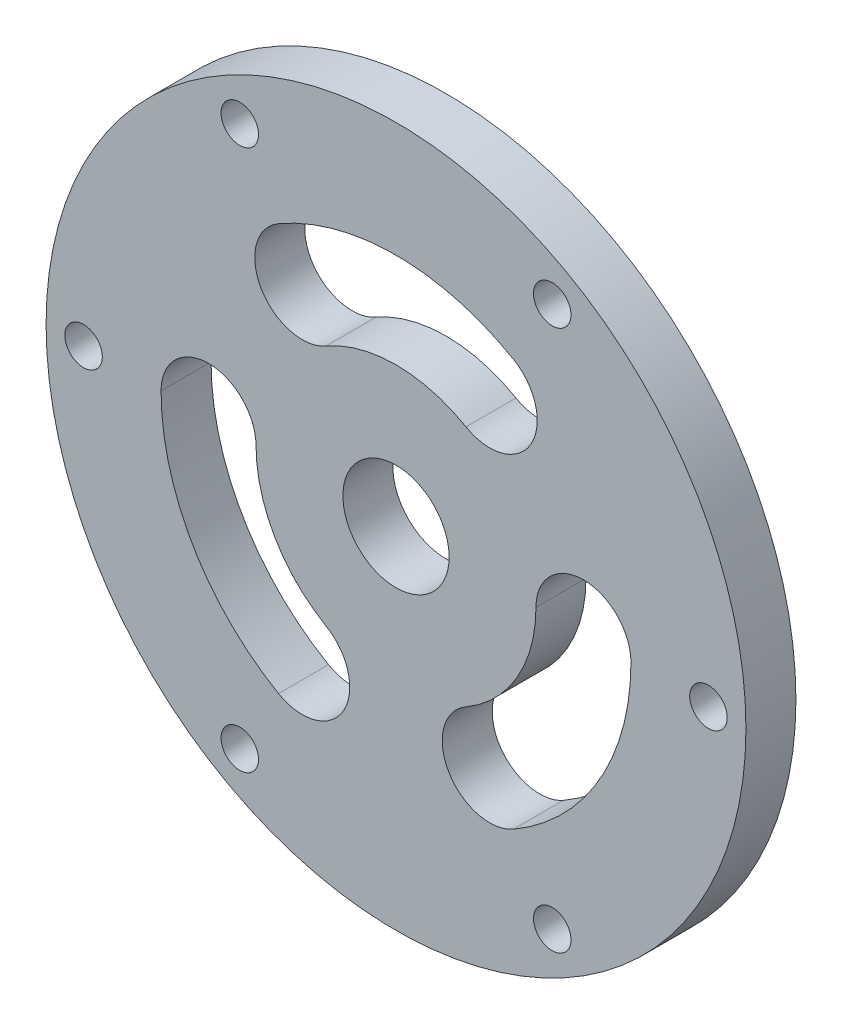
ISO-10303-21;
HEADER;
FILE_DESCRIPTION(('STEP AP214'),'2;1');
FILE_NAME('part.step','',(''),(''),'','','');
FILE_SCHEMA(('AUTOMOTIVE_DESIGN { 1 0 10303 214 1 1 1 1 }'));
ENDSEC;
DATA;
#1=APPLICATION_CONTEXT('core data for automotive mechanical design processes');
#2=APPLICATION_PROTOCOL_DEFINITION('international standard','automotive_design',2000,#1);
#3=PRODUCT_CONTEXT('',#1,'mechanical');
#4=PRODUCT('Part','Part','',(#3));
#5=PRODUCT_RELATED_PRODUCT_CATEGORY('part','',(#4));
#6=PRODUCT_DEFINITION_FORMATION('','',#4);
#7=PRODUCT_DEFINITION_CONTEXT('part definition',#1,'design');
#8=PRODUCT_DEFINITION('design','',#6,#7);
#9=PRODUCT_DEFINITION_SHAPE('','',#8);
#10=(LENGTH_UNIT() NAMED_UNIT(*) SI_UNIT(.MILLI.,.METRE.));
#11=(NAMED_UNIT(*) PLANE_ANGLE_UNIT() SI_UNIT($,.RADIAN.));
#12=(NAMED_UNIT(*) SI_UNIT($,.STERADIAN.) SOLID_ANGLE_UNIT());
#13=UNCERTAINTY_MEASURE_WITH_UNIT(LENGTH_MEASURE(1.E-05),#10,'distance_accuracy_value','');
#14=(GEOMETRIC_REPRESENTATION_CONTEXT(3) GLOBAL_UNCERTAINTY_ASSIGNED_CONTEXT((#13)) GLOBAL_UNIT_ASSIGNED_CONTEXT((#10,
#11,#12)) REPRESENTATION_CONTEXT('',''));
#15=CARTESIAN_POINT('',(0.,0.,0.));
#16=DIRECTION('',(0.,0.,1.));
#17=DIRECTION('',(1.,0.,0.));
#18=AXIS2_PLACEMENT_3D('',#15,#16,#17);
#19=CARTESIAN_POINT('',(0.,0.,4.));
#20=DIRECTION('',(0.,0.,1.));
#21=DIRECTION('',(1.,0.,0.));
#22=AXIS2_PLACEMENT_3D('',#19,#20,#21);
#23=PLANE('',#22);
#24=CARTESIAN_POINT('',(-24.9999999999986,-2.4721941194024E-12,4.));
#25=DIRECTION('',(0.,0.,1.));
#26=DIRECTION('',(1.,0.,0.));
#27=AXIS2_PLACEMENT_3D('',#24,#25,#26);
#28=CIRCLE('',#27,1.5000000000031);
#29=CARTESIAN_POINT('',(-23.4999999999955,-2.4721941194024E-12,4.));
#30=VERTEX_POINT('',#29);
#31=EDGE_CURVE('E269',#30,#30,#28,.T.);
#32=ORIENTED_EDGE('',*,*,#31,.F.);
#33=EDGE_LOOP('',(#32));
#34=FACE_BOUND('',#33,.T.);
#35=CARTESIAN_POINT('',(12.5000000000029,-21.650635094611,4.));
#36=DIRECTION('',(0.,0.,1.));
#37=DIRECTION('',(1.,0.,0.));
#38=AXIS2_PLACEMENT_3D('',#35,#36,#37);
#39=CIRCLE('',#38,1.5000000000031);
#40=CARTESIAN_POINT('',(14.000000000006,-21.650635094611,4.));
#41=VERTEX_POINT('',#40);
#42=EDGE_CURVE('E277',#41,#41,#39,.T.);
#43=ORIENTED_EDGE('',*,*,#42,.F.);
#44=EDGE_LOOP('',(#43));
#45=FACE_BOUND('',#44,.T.);
#46=CARTESIAN_POINT('',(0.,0.,4.));
#47=DIRECTION('',(0.,0.,-1.));
#48=DIRECTION('',(1.,0.,0.));
#49=AXIS2_PLACEMENT_3D('',#46,#47,#48);
#50=CIRCLE('',#49,11.2);
#51=CARTESIAN_POINT('',(-5.59999999999981,9.69948452238582,4.));
#52=VERTEX_POINT('',#51);
#53=CARTESIAN_POINT('',(5.60000000000007,9.69948452238566,4.));
#54=VERTEX_POINT('',#53);
#55=EDGE_CURVE('E129',#52,#54,#50,.T.);
#56=ORIENTED_EDGE('',*,*,#55,.F.);
#57=CARTESIAN_POINT('',(-7.49999999999975,12.9903810567667,4.));
#58=DIRECTION('',(0.,0.,1.));
#59=DIRECTION('',(-1.,0.,0.));
#60=AXIS2_PLACEMENT_3D('',#57,#58,#59);
#61=CIRCLE('',#60,3.8);
#62=CARTESIAN_POINT('',(-9.39999999999968,16.2812775911476,4.));
#63=VERTEX_POINT('',#62);
#64=EDGE_CURVE('E121',#63,#52,#61,.T.);
#65=ORIENTED_EDGE('',*,*,#64,.F.);
#66=CARTESIAN_POINT('',(0.,0.,4.));
#67=DIRECTION('',(0.,0.,1.));
#68=DIRECTION('',(1.,0.,0.));
#69=AXIS2_PLACEMENT_3D('',#66,#67,#68);
#70=CIRCLE('',#69,18.8);
#71=CARTESIAN_POINT('',(9.40000000000013,16.2812775911474,4.));
#72=VERTEX_POINT('',#71);
#73=EDGE_CURVE('E144',#72,#63,#70,.T.);
#74=ORIENTED_EDGE('',*,*,#73,.F.);
#75=CARTESIAN_POINT('',(7.5000000000001,12.9903810567665,4.));
#76=DIRECTION('',(0.,0.,1.));
#77=DIRECTION('',(1.,0.,0.));
#78=AXIS2_PLACEMENT_3D('',#75,#76,#77);
#79=CIRCLE('',#78,3.8);
#80=EDGE_CURVE('E142',#54,#72,#79,.T.);
#81=ORIENTED_EDGE('',*,*,#80,.F.);
#82=EDGE_LOOP('',(#56,#65,#74,#81));
#83=FACE_BOUND('',#82,.T.);
#84=CARTESIAN_POINT('',(12.5,21.650635094611,4.));
#85=DIRECTION('',(0.,0.,1.));
#86=DIRECTION('',(1.,0.,0.));
#87=AXIS2_PLACEMENT_3D('',#84,#85,#86);
#88=CIRCLE('',#87,1.5000000000031);
#89=CARTESIAN_POINT('',(14.0000000000031,21.650635094611,4.));
#90=VERTEX_POINT('',#89);
#91=EDGE_CURVE('E160',#90,#90,#88,.T.);
#92=ORIENTED_EDGE('',*,*,#91,.F.);
#93=EDGE_LOOP('',(#92));
#94=FACE_BOUND('',#93,.T.);
#95=CARTESIAN_POINT('',(0.,0.,4.));
#96=DIRECTION('',(0.,0.,-1.));
#97=DIRECTION('',(1.,0.,0.));
#98=AXIS2_PLACEMENT_3D('',#95,#96,#97);
#99=CIRCLE('',#98,11.2);
#100=CARTESIAN_POINT('',(-5.60000000000015,-9.69948452238563,4.));
#101=VERTEX_POINT('',#100);
#102=CARTESIAN_POINT('',(-11.2,0.,4.));
#103=VERTEX_POINT('',#102);
#104=EDGE_CURVE('E174',#101,#103,#99,.T.);
#105=ORIENTED_EDGE('',*,*,#104,.F.);
#106=CARTESIAN_POINT('',(-7.5000000000002,-12.9903810567665,4.));
#107=DIRECTION('',(0.,0.,1.));
#108=DIRECTION('',(-1.,0.,0.));
#109=AXIS2_PLACEMENT_3D('',#106,#107,#108);
#110=CIRCLE('',#109,3.8);
#111=CARTESIAN_POINT('',(-9.40000000000025,-16.2812775911473,4.));
#112=VERTEX_POINT('',#111);
#113=EDGE_CURVE('E172',#112,#101,#110,.T.);
#114=ORIENTED_EDGE('',*,*,#113,.F.);
#115=CARTESIAN_POINT('',(0.,0.,4.));
#116=DIRECTION('',(0.,0.,1.));
#117=DIRECTION('',(1.,0.,0.));
#118=AXIS2_PLACEMENT_3D('',#115,#116,#117);
#119=CIRCLE('',#118,18.8);
#120=CARTESIAN_POINT('',(-18.8,0.,4.));
#121=VERTEX_POINT('',#120);
#122=EDGE_CURVE('E180',#121,#112,#119,.T.);
#123=ORIENTED_EDGE('',*,*,#122,.F.);
#124=CARTESIAN_POINT('',(-15.,0.,4.));
#125=DIRECTION('',(0.,0.,1.));
#126=DIRECTION('',(1.,0.,0.));
#127=AXIS2_PLACEMENT_3D('',#124,#125,#126);
#128=CIRCLE('',#127,3.8);
#129=EDGE_CURVE('E177',#103,#121,#128,.T.);
#130=ORIENTED_EDGE('',*,*,#129,.F.);
#131=EDGE_LOOP('',(#105,#114,#123,#130));
#132=FACE_BOUND('',#131,.T.);
#133=CARTESIAN_POINT('',(15.,-1.57859836313889E-13,4.));
#134=DIRECTION('',(0.,0.,1.));
#135=DIRECTION('',(-1.,0.,0.));
#136=AXIS2_PLACEMENT_3D('',#133,#134,#135);
#137=CIRCLE('',#136,3.8);
#138=CARTESIAN_POINT('',(18.8,-1.96207867471109E-13,4.));
#139=VERTEX_POINT('',#138);
#140=CARTESIAN_POINT('',(11.2,-1.17961196366423E-13,4.));
#141=VERTEX_POINT('',#140);
#142=EDGE_CURVE('E205',#139,#141,#137,.T.);
#143=ORIENTED_EDGE('',*,*,#142,.F.);
#144=CARTESIAN_POINT('',(0.,0.,4.));
#145=DIRECTION('',(0.,0.,1.));
#146=DIRECTION('',(1.,0.,0.));
#147=AXIS2_PLACEMENT_3D('',#144,#145,#146);
#148=CIRCLE('',#147,18.8);
#149=CARTESIAN_POINT('',(9.40000000000002,-16.2812775911474,4.));
#150=VERTEX_POINT('',#149);
#151=EDGE_CURVE('E203',#150,#139,#148,.T.);
#152=ORIENTED_EDGE('',*,*,#151,.F.);
#153=CARTESIAN_POINT('',(7.50000000000002,-12.9903810567666,4.));
#154=DIRECTION('',(0.,0.,1.));
#155=DIRECTION('',(1.,0.,0.));
#156=AXIS2_PLACEMENT_3D('',#153,#154,#155);
#157=CIRCLE('',#156,3.8);
#158=CARTESIAN_POINT('',(5.60000000000001,-9.69948452238571,4.));
#159=VERTEX_POINT('',#158);
#160=EDGE_CURVE('E211',#159,#150,#157,.T.);
#161=ORIENTED_EDGE('',*,*,#160,.F.);
#162=CARTESIAN_POINT('',(0.,0.,4.));
#163=DIRECTION('',(0.,0.,-1.));
#164=DIRECTION('',(1.,0.,0.));
#165=AXIS2_PLACEMENT_3D('',#162,#163,#164);
#166=CIRCLE('',#165,11.2);
#167=EDGE_CURVE('E208',#141,#159,#166,.T.);
#168=ORIENTED_EDGE('',*,*,#167,.F.);
#169=EDGE_LOOP('',(#143,#152,#161,#168));
#170=FACE_BOUND('',#169,.T.);
#171=CARTESIAN_POINT('',(0.,0.,4.));
#172=DIRECTION('',(0.,0.,1.));
#173=DIRECTION('',(1.,0.,0.));
#174=AXIS2_PLACEMENT_3D('',#171,#172,#173);
#175=CIRCLE('',#174,28.);
#176=CARTESIAN_POINT('',(28.,0.,4.));
#177=VERTEX_POINT('',#176);
#178=EDGE_CURVE('E11',#177,#177,#175,.T.);
#179=ORIENTED_EDGE('',*,*,#178,.T.);
#180=EDGE_LOOP('',(#179));
#181=FACE_BOUND('',#180,.T.);
#182=CARTESIAN_POINT('',(0.,0.,4.));
#183=DIRECTION('',(0.,0.,1.));
#184=DIRECTION('',(1.,0.,0.));
#185=AXIS2_PLACEMENT_3D('',#182,#183,#184);
#186=CIRCLE('',#185,4.25);
#187=CARTESIAN_POINT('',(4.25,0.,4.));
#188=VERTEX_POINT('',#187);
#189=EDGE_CURVE('E166',#188,#188,#186,.T.);
#190=ORIENTED_EDGE('',*,*,#189,.F.);
#191=EDGE_LOOP('',(#190));
#192=FACE_BOUND('',#191,.T.);
#193=CARTESIAN_POINT('',(25.0000000000014,8.27893104610886E-13,4.));
#194=DIRECTION('',(0.,0.,1.));
#195=DIRECTION('',(1.,0.,0.));
#196=AXIS2_PLACEMENT_3D('',#193,#194,#195);
#197=CIRCLE('',#196,1.5000000000031);
#198=CARTESIAN_POINT('',(26.5000000000045,8.27893104610886E-13,4.));
#199=VERTEX_POINT('',#198);
#200=EDGE_CURVE('E150',#199,#199,#197,.T.);
#201=ORIENTED_EDGE('',*,*,#200,.F.);
#202=EDGE_LOOP('',(#201));
#203=FACE_BOUND('',#202,.T.);
#204=CARTESIAN_POINT('',(-12.4999999999971,-21.6506350946126,4.));
#205=DIRECTION('',(0.,0.,1.));
#206=DIRECTION('',(1.,0.,0.));
#207=AXIS2_PLACEMENT_3D('',#204,#205,#206);
#208=CIRCLE('',#207,1.5000000000031);
#209=CARTESIAN_POINT('',(-10.999999999994,-21.6506350946126,4.));
#210=VERTEX_POINT('',#209);
#211=EDGE_CURVE('E273',#210,#210,#208,.T.);
#212=ORIENTED_EDGE('',*,*,#211,.F.);
#213=EDGE_LOOP('',(#212));
#214=FACE_BOUND('',#213,.T.);
#215=CARTESIAN_POINT('',(-12.5,21.6506350946093,4.));
#216=DIRECTION('',(0.,0.,1.));
#217=DIRECTION('',(1.,0.,0.));
#218=AXIS2_PLACEMENT_3D('',#215,#216,#217);
#219=CIRCLE('',#218,1.5000000000031);
#220=CARTESIAN_POINT('',(-10.9999999999969,21.6506350946093,4.));
#221=VERTEX_POINT('',#220);
#222=EDGE_CURVE('E264',#221,#221,#219,.T.);
#223=ORIENTED_EDGE('',*,*,#222,.F.);
#224=EDGE_LOOP('',(#223));
#225=FACE_BOUND('',#224,.T.);
#226=ADVANCED_FACE('F32',(#34,#45,#83,#94,#132,#170,#181,#192,#203,#214,#225),#23,.T.);
#227=CARTESIAN_POINT('',(0.,0.,0.));
#228=DIRECTION('',(0.,0.,1.));
#229=DIRECTION('',(1.,0.,0.));
#230=AXIS2_PLACEMENT_3D('',#227,#228,#229);
#231=PLANE('',#230);
#232=CARTESIAN_POINT('',(12.5,21.650635094611,0.));
#233=DIRECTION('',(0.,0.,1.));
#234=DIRECTION('',(1.,0.,0.));
#235=AXIS2_PLACEMENT_3D('',#232,#233,#234);
#236=CIRCLE('',#235,1.5000000000031);
#237=CARTESIAN_POINT('',(14.0000000000031,21.650635094611,0.));
#238=VERTEX_POINT('',#237);
#239=EDGE_CURVE('E137',#238,#238,#236,.T.);
#240=ORIENTED_EDGE('',*,*,#239,.T.);
#241=EDGE_LOOP('',(#240));
#242=FACE_BOUND('',#241,.T.);
#243=CARTESIAN_POINT('',(0.,0.,0.));
#244=DIRECTION('',(0.,0.,1.));
#245=DIRECTION('',(1.,0.,0.));
#246=AXIS2_PLACEMENT_3D('',#243,#244,#245);
#247=CIRCLE('',#246,4.25);
#248=CARTESIAN_POINT('',(4.25,0.,0.));
#249=VERTEX_POINT('',#248);
#250=EDGE_CURVE('E163',#249,#249,#247,.T.);
#251=ORIENTED_EDGE('',*,*,#250,.T.);
#252=EDGE_LOOP('',(#251));
#253=FACE_BOUND('',#252,.T.);
#254=CARTESIAN_POINT('',(-7.5000000000002,-12.9903810567665,0.));
#255=DIRECTION('',(0.,0.,1.));
#256=DIRECTION('',(-1.,0.,0.));
#257=AXIS2_PLACEMENT_3D('',#254,#255,#256);
#258=CIRCLE('',#257,3.8);
#259=CARTESIAN_POINT('',(-9.40000000000025,-16.2812775911473,0.));
#260=VERTEX_POINT('',#259);
#261=CARTESIAN_POINT('',(-5.60000000000015,-9.69948452238563,0.));
#262=VERTEX_POINT('',#261);
#263=EDGE_CURVE('E169',#260,#262,#258,.T.);
#264=ORIENTED_EDGE('',*,*,#263,.T.);
#265=CARTESIAN_POINT('',(0.,0.,0.));
#266=DIRECTION('',(0.,0.,-1.));
#267=DIRECTION('',(1.,0.,0.));
#268=AXIS2_PLACEMENT_3D('',#265,#266,#267);
#269=CIRCLE('',#268,11.2);
#270=CARTESIAN_POINT('',(-11.2,0.,0.));
#271=VERTEX_POINT('',#270);
#272=EDGE_CURVE('E185',#262,#271,#269,.T.);
#273=ORIENTED_EDGE('',*,*,#272,.T.);
#274=CARTESIAN_POINT('',(-15.,0.,0.));
#275=DIRECTION('',(0.,0.,1.));
#276=DIRECTION('',(1.,0.,0.));
#277=AXIS2_PLACEMENT_3D('',#274,#275,#276);
#278=CIRCLE('',#277,3.8);
#279=CARTESIAN_POINT('',(-18.8,0.,0.));
#280=VERTEX_POINT('',#279);
#281=EDGE_CURVE('E188',#271,#280,#278,.T.);
#282=ORIENTED_EDGE('',*,*,#281,.T.);
#283=CARTESIAN_POINT('',(0.,0.,0.));
#284=DIRECTION('',(0.,0.,1.));
#285=DIRECTION('',(1.,0.,0.));
#286=AXIS2_PLACEMENT_3D('',#283,#284,#285);
#287=CIRCLE('',#286,18.8);
#288=EDGE_CURVE('E175',#280,#260,#287,.T.);
#289=ORIENTED_EDGE('',*,*,#288,.T.);
#290=EDGE_LOOP('',(#264,#273,#282,#289));
#291=FACE_BOUND('',#290,.T.);
#292=CARTESIAN_POINT('',(0.,0.,0.));
#293=DIRECTION('',(0.,0.,1.));
#294=DIRECTION('',(1.,0.,0.));
#295=AXIS2_PLACEMENT_3D('',#292,#293,#294);
#296=CIRCLE('',#295,28.);
#297=CARTESIAN_POINT('',(28.,0.,0.));
#298=VERTEX_POINT('',#297);
#299=EDGE_CURVE('E36',#298,#298,#296,.T.);
#300=ORIENTED_EDGE('',*,*,#299,.F.);
#301=EDGE_LOOP('',(#300));
#302=FACE_BOUND('',#301,.T.);
#303=CARTESIAN_POINT('',(0.,0.,0.));
#304=DIRECTION('',(0.,0.,1.));
#305=DIRECTION('',(1.,0.,0.));
#306=AXIS2_PLACEMENT_3D('',#303,#304,#305);
#307=CIRCLE('',#306,18.8);
#308=CARTESIAN_POINT('',(9.40000000000002,-16.2812775911474,0.));
#309=VERTEX_POINT('',#308);
#310=CARTESIAN_POINT('',(18.8,-1.96207867471109E-13,0.));
#311=VERTEX_POINT('',#310);
#312=EDGE_CURVE('E202',#309,#311,#307,.T.);
#313=ORIENTED_EDGE('',*,*,#312,.T.);
#314=CARTESIAN_POINT('',(15.,-1.57859836313889E-13,0.));
#315=DIRECTION('',(0.,0.,1.));
#316=DIRECTION('',(-1.,0.,0.));
#317=AXIS2_PLACEMENT_3D('',#314,#315,#316);
#318=CIRCLE('',#317,3.8);
#319=CARTESIAN_POINT('',(11.2,-1.17961196366423E-13,0.));
#320=VERTEX_POINT('',#319);
#321=EDGE_CURVE('E216',#311,#320,#318,.T.);
#322=ORIENTED_EDGE('',*,*,#321,.T.);
#323=CARTESIAN_POINT('',(0.,0.,0.));
#324=DIRECTION('',(0.,0.,-1.));
#325=DIRECTION('',(1.,0.,0.));
#326=AXIS2_PLACEMENT_3D('',#323,#324,#325);
#327=CIRCLE('',#326,11.2);
#328=CARTESIAN_POINT('',(5.60000000000001,-9.69948452238571,0.));
#329=VERTEX_POINT('',#328);
#330=EDGE_CURVE('E219',#320,#329,#327,.T.);
#331=ORIENTED_EDGE('',*,*,#330,.T.);
#332=CARTESIAN_POINT('',(7.50000000000002,-12.9903810567666,0.));
#333=DIRECTION('',(0.,0.,1.));
#334=DIRECTION('',(1.,0.,0.));
#335=AXIS2_PLACEMENT_3D('',#332,#333,#334);
#336=CIRCLE('',#335,3.8);
#337=EDGE_CURVE('E206',#329,#309,#336,.T.);
#338=ORIENTED_EDGE('',*,*,#337,.T.);
#339=EDGE_LOOP('',(#313,#322,#331,#338));
#340=FACE_BOUND('',#339,.T.);
#341=CARTESIAN_POINT('',(-7.49999999999975,12.9903810567667,0.));
#342=DIRECTION('',(0.,0.,1.));
#343=DIRECTION('',(-1.,0.,0.));
#344=AXIS2_PLACEMENT_3D('',#341,#342,#343);
#345=CIRCLE('',#344,3.8);
#346=CARTESIAN_POINT('',(-9.39999999999968,16.2812775911476,0.));
#347=VERTEX_POINT('',#346);
#348=CARTESIAN_POINT('',(-5.59999999999981,9.69948452238582,0.));
#349=VERTEX_POINT('',#348);
#350=EDGE_CURVE('E55',#347,#349,#345,.T.);
#351=ORIENTED_EDGE('',*,*,#350,.T.);
#352=CARTESIAN_POINT('',(0.,0.,0.));
#353=DIRECTION('',(0.,0.,-1.));
#354=DIRECTION('',(1.,0.,0.));
#355=AXIS2_PLACEMENT_3D('',#352,#353,#354);
#356=CIRCLE('',#355,11.2);
#357=CARTESIAN_POINT('',(5.60000000000007,9.69948452238566,0.));
#358=VERTEX_POINT('',#357);
#359=EDGE_CURVE('E136',#349,#358,#356,.T.);
#360=ORIENTED_EDGE('',*,*,#359,.T.);
#361=CARTESIAN_POINT('',(7.5000000000001,12.9903810567665,0.));
#362=DIRECTION('',(0.,0.,1.));
#363=DIRECTION('',(1.,0.,0.));
#364=AXIS2_PLACEMENT_3D('',#361,#362,#363);
#365=CIRCLE('',#364,3.8);
#366=CARTESIAN_POINT('',(9.40000000000013,16.2812775911474,0.));
#367=VERTEX_POINT('',#366);
#368=EDGE_CURVE('E152',#358,#367,#365,.T.);
#369=ORIENTED_EDGE('',*,*,#368,.T.);
#370=CARTESIAN_POINT('',(0.,0.,0.));
#371=DIRECTION('',(0.,0.,1.));
#372=DIRECTION('',(1.,0.,0.));
#373=AXIS2_PLACEMENT_3D('',#370,#371,#372);
#374=CIRCLE('',#373,18.8);
#375=EDGE_CURVE('E130',#367,#347,#374,.T.);
#376=ORIENTED_EDGE('',*,*,#375,.T.);
#377=EDGE_LOOP('',(#351,#360,#369,#376));
#378=FACE_BOUND('',#377,.T.);
#379=CARTESIAN_POINT('',(25.0000000000014,8.27893104610886E-13,0.));
#380=DIRECTION('',(0.,0.,1.));
#381=DIRECTION('',(1.,0.,0.));
#382=AXIS2_PLACEMENT_3D('',#379,#380,#381);
#383=CIRCLE('',#382,1.5000000000031);
#384=CARTESIAN_POINT('',(26.5000000000045,8.27893104610886E-13,0.));
#385=VERTEX_POINT('',#384);
#386=EDGE_CURVE('E247',#385,#385,#383,.T.);
#387=ORIENTED_EDGE('',*,*,#386,.T.);
#388=EDGE_LOOP('',(#387));
#389=FACE_BOUND('',#388,.T.);
#390=CARTESIAN_POINT('',(12.5000000000029,-21.650635094611,0.));
#391=DIRECTION('',(0.,0.,1.));
#392=DIRECTION('',(1.,0.,0.));
#393=AXIS2_PLACEMENT_3D('',#390,#391,#392);
#394=CIRCLE('',#393,1.5000000000031);
#395=CARTESIAN_POINT('',(14.000000000006,-21.650635094611,0.));
#396=VERTEX_POINT('',#395);
#397=EDGE_CURVE('E251',#396,#396,#394,.T.);
#398=ORIENTED_EDGE('',*,*,#397,.T.);
#399=EDGE_LOOP('',(#398));
#400=FACE_BOUND('',#399,.T.);
#401=CARTESIAN_POINT('',(-12.4999999999971,-21.6506350946126,0.));
#402=DIRECTION('',(0.,0.,1.));
#403=DIRECTION('',(1.,0.,0.));
#404=AXIS2_PLACEMENT_3D('',#401,#402,#403);
#405=CIRCLE('',#404,1.5000000000031);
#406=CARTESIAN_POINT('',(-10.999999999994,-21.6506350946126,0.));
#407=VERTEX_POINT('',#406);
#408=EDGE_CURVE('E255',#407,#407,#405,.T.);
#409=ORIENTED_EDGE('',*,*,#408,.T.);
#410=EDGE_LOOP('',(#409));
#411=FACE_BOUND('',#410,.T.);
#412=CARTESIAN_POINT('',(-24.9999999999986,-2.4721941194024E-12,0.));
#413=DIRECTION('',(0.,0.,1.));
#414=DIRECTION('',(1.,0.,0.));
#415=AXIS2_PLACEMENT_3D('',#412,#413,#414);
#416=CIRCLE('',#415,1.5000000000031);
#417=CARTESIAN_POINT('',(-23.4999999999955,-2.4721941194024E-12,0.));
#418=VERTEX_POINT('',#417);
#419=EDGE_CURVE('E259',#418,#418,#416,.T.);
#420=ORIENTED_EDGE('',*,*,#419,.T.);
#421=EDGE_LOOP('',(#420));
#422=FACE_BOUND('',#421,.T.);
#423=CARTESIAN_POINT('',(-12.5,21.6506350946093,0.));
#424=DIRECTION('',(0.,0.,1.));
#425=DIRECTION('',(1.,0.,0.));
#426=AXIS2_PLACEMENT_3D('',#423,#424,#425);
#427=CIRCLE('',#426,1.5000000000031);
#428=CARTESIAN_POINT('',(-10.9999999999969,21.6506350946093,0.));
#429=VERTEX_POINT('',#428);
#430=EDGE_CURVE('E262',#429,#429,#427,.T.);
#431=ORIENTED_EDGE('',*,*,#430,.T.);
#432=EDGE_LOOP('',(#431));
#433=FACE_BOUND('',#432,.T.);
#434=ADVANCED_FACE('F238',(#242,#253,#291,#302,#340,#378,#389,#400,#411,#422,#433),#231,.F.);
#435=CARTESIAN_POINT('',(0.,0.,4.));
#436=DIRECTION('',(0.,0.,-1.));
#437=DIRECTION('',(-1.,0.,0.));
#438=AXIS2_PLACEMENT_3D('',#435,#436,#437);
#439=CYLINDRICAL_SURFACE('',#438,28.);
#440=ORIENTED_EDGE('',*,*,#178,.F.);
#441=EDGE_LOOP('',(#440));
#442=FACE_BOUND('',#441,.T.);
#443=ORIENTED_EDGE('',*,*,#299,.T.);
#444=EDGE_LOOP('',(#443));
#445=FACE_BOUND('',#444,.T.);
#446=ADVANCED_FACE('F34',(#442,#445),#439,.T.);
#447=CARTESIAN_POINT('',(0.,0.,4.));
#448=DIRECTION('',(0.,0.,-1.));
#449=DIRECTION('',(-1.,0.,0.));
#450=AXIS2_PLACEMENT_3D('',#447,#448,#449);
#451=CYLINDRICAL_SURFACE('',#450,18.8);
#452=ORIENTED_EDGE('',*,*,#312,.F.);
#453=DIRECTION('',(0.,0.,-1.));
#454=VECTOR('',#453,1.);
#455=CARTESIAN_POINT('',(9.40000000000002,-16.2812775911474,4.));
#456=LINE('',#455,#454);
#457=EDGE_CURVE('E213',#150,#309,#456,.T.);
#458=ORIENTED_EDGE('',*,*,#457,.F.);
#459=ORIENTED_EDGE('',*,*,#151,.T.);
#460=DIRECTION('',(0.,0.,-1.));
#461=VECTOR('',#460,1.);
#462=CARTESIAN_POINT('',(18.8,-1.96207867471109E-13,4.));
#463=LINE('',#462,#461);
#464=EDGE_CURVE('E230',#139,#311,#463,.T.);
#465=ORIENTED_EDGE('',*,*,#464,.T.);
#466=EDGE_LOOP('',(#452,#458,#459,#465));
#467=FACE_BOUND('',#466,.T.);
#468=ADVANCED_FACE('F361',(#467),#451,.F.);
#469=CARTESIAN_POINT('',(15.,-1.57859836313889E-13,4.));
#470=DIRECTION('',(0.,0.,-1.));
#471=DIRECTION('',(-1.,0.,0.));
#472=AXIS2_PLACEMENT_3D('',#469,#470,#471);
#473=CYLINDRICAL_SURFACE('',#472,3.8);
#474=ORIENTED_EDGE('',*,*,#321,.F.);
#475=ORIENTED_EDGE('',*,*,#464,.F.);
#476=ORIENTED_EDGE('',*,*,#142,.T.);
#477=DIRECTION('',(0.,0.,-1.));
#478=VECTOR('',#477,1.);
#479=CARTESIAN_POINT('',(11.2,-1.17961196366423E-13,4.));
#480=LINE('',#479,#478);
#481=EDGE_CURVE('E228',#141,#320,#480,.T.);
#482=ORIENTED_EDGE('',*,*,#481,.T.);
#483=EDGE_LOOP('',(#474,#475,#476,#482));
#484=FACE_BOUND('',#483,.T.);
#485=ADVANCED_FACE('F357',(#484),#473,.F.);
#486=CARTESIAN_POINT('',(0.,0.,4.));
#487=DIRECTION('',(0.,0.,-1.));
#488=DIRECTION('',(-1.,0.,0.));
#489=AXIS2_PLACEMENT_3D('',#486,#487,#488);
#490=CYLINDRICAL_SURFACE('',#489,11.2);
#491=ORIENTED_EDGE('',*,*,#330,.F.);
#492=ORIENTED_EDGE('',*,*,#481,.F.);
#493=ORIENTED_EDGE('',*,*,#167,.T.);
#494=DIRECTION('',(0.,0.,-1.));
#495=VECTOR('',#494,1.);
#496=CARTESIAN_POINT('',(5.60000000000001,-9.69948452238571,4.));
#497=LINE('',#496,#495);
#498=EDGE_CURVE('E226',#159,#329,#497,.T.);
#499=ORIENTED_EDGE('',*,*,#498,.T.);
#500=EDGE_LOOP('',(#491,#492,#493,#499));
#501=FACE_BOUND('',#500,.T.);
#502=ADVANCED_FACE('F353',(#501),#490,.T.);
#503=CARTESIAN_POINT('',(7.50000000000002,-12.9903810567666,4.));
#504=DIRECTION('',(0.,0.,-1.));
#505=DIRECTION('',(-1.,0.,0.));
#506=AXIS2_PLACEMENT_3D('',#503,#504,#505);
#507=CYLINDRICAL_SURFACE('',#506,3.8);
#508=ORIENTED_EDGE('',*,*,#337,.F.);
#509=ORIENTED_EDGE('',*,*,#498,.F.);
#510=ORIENTED_EDGE('',*,*,#160,.T.);
#511=ORIENTED_EDGE('',*,*,#457,.T.);
#512=EDGE_LOOP('',(#508,#509,#510,#511));
#513=FACE_BOUND('',#512,.T.);
#514=ADVANCED_FACE('F349',(#513),#507,.F.);
#515=CARTESIAN_POINT('',(-7.5000000000002,-12.9903810567665,4.));
#516=DIRECTION('',(0.,0.,-1.));
#517=DIRECTION('',(-1.,0.,0.));
#518=AXIS2_PLACEMENT_3D('',#515,#516,#517);
#519=CYLINDRICAL_SURFACE('',#518,3.8);
#520=ORIENTED_EDGE('',*,*,#263,.F.);
#521=DIRECTION('',(0.,0.,-1.));
#522=VECTOR('',#521,1.);
#523=CARTESIAN_POINT('',(-9.40000000000025,-16.2812775911473,4.));
#524=LINE('',#523,#522);
#525=EDGE_CURVE('E182',#112,#260,#524,.T.);
#526=ORIENTED_EDGE('',*,*,#525,.F.);
#527=ORIENTED_EDGE('',*,*,#113,.T.);
#528=DIRECTION('',(0.,0.,-1.));
#529=VECTOR('',#528,1.);
#530=CARTESIAN_POINT('',(-5.60000000000015,-9.69948452238563,4.));
#531=LINE('',#530,#529);
#532=EDGE_CURVE('E199',#101,#262,#531,.T.);
#533=ORIENTED_EDGE('',*,*,#532,.T.);
#534=EDGE_LOOP('',(#520,#526,#527,#533));
#535=FACE_BOUND('',#534,.T.);
#536=ADVANCED_FACE('F345',(#535),#519,.F.);
#537=CARTESIAN_POINT('',(0.,0.,4.));
#538=DIRECTION('',(0.,0.,-1.));
#539=DIRECTION('',(-1.,0.,0.));
#540=AXIS2_PLACEMENT_3D('',#537,#538,#539);
#541=CYLINDRICAL_SURFACE('',#540,11.2);
#542=ORIENTED_EDGE('',*,*,#272,.F.);
#543=ORIENTED_EDGE('',*,*,#532,.F.);
#544=ORIENTED_EDGE('',*,*,#104,.T.);
#545=DIRECTION('',(0.,0.,-1.));
#546=VECTOR('',#545,1.);
#547=CARTESIAN_POINT('',(-11.2,0.,4.));
#548=LINE('',#547,#546);
#549=EDGE_CURVE('E197',#103,#271,#548,.T.);
#550=ORIENTED_EDGE('',*,*,#549,.T.);
#551=EDGE_LOOP('',(#542,#543,#544,#550));
#552=FACE_BOUND('',#551,.T.);
#553=ADVANCED_FACE('F341',(#552),#541,.T.);
#554=CARTESIAN_POINT('',(-15.,0.,4.));
#555=DIRECTION('',(0.,0.,-1.));
#556=DIRECTION('',(-1.,0.,0.));
#557=AXIS2_PLACEMENT_3D('',#554,#555,#556);
#558=CYLINDRICAL_SURFACE('',#557,3.8);
#559=ORIENTED_EDGE('',*,*,#281,.F.);
#560=ORIENTED_EDGE('',*,*,#549,.F.);
#561=ORIENTED_EDGE('',*,*,#129,.T.);
#562=DIRECTION('',(0.,0.,-1.));
#563=VECTOR('',#562,1.);
#564=CARTESIAN_POINT('',(-18.8,0.,4.));
#565=LINE('',#564,#563);
#566=EDGE_CURVE('E195',#121,#280,#565,.T.);
#567=ORIENTED_EDGE('',*,*,#566,.T.);
#568=EDGE_LOOP('',(#559,#560,#561,#567));
#569=FACE_BOUND('',#568,.T.);
#570=ADVANCED_FACE('F337',(#569),#558,.F.);
#571=CARTESIAN_POINT('',(0.,0.,4.));
#572=DIRECTION('',(0.,0.,-1.));
#573=DIRECTION('',(-1.,0.,0.));
#574=AXIS2_PLACEMENT_3D('',#571,#572,#573);
#575=CYLINDRICAL_SURFACE('',#574,18.8);
#576=ORIENTED_EDGE('',*,*,#288,.F.);
#577=ORIENTED_EDGE('',*,*,#566,.F.);
#578=ORIENTED_EDGE('',*,*,#122,.T.);
#579=ORIENTED_EDGE('',*,*,#525,.T.);
#580=EDGE_LOOP('',(#576,#577,#578,#579));
#581=FACE_BOUND('',#580,.T.);
#582=ADVANCED_FACE('F333',(#581),#575,.F.);
#583=CARTESIAN_POINT('',(0.,0.,4.));
#584=DIRECTION('',(0.,0.,-1.));
#585=DIRECTION('',(-1.,0.,0.));
#586=AXIS2_PLACEMENT_3D('',#583,#584,#585);
#587=CYLINDRICAL_SURFACE('',#586,4.25);
#588=ORIENTED_EDGE('',*,*,#189,.T.);
#589=EDGE_LOOP('',(#588));
#590=FACE_BOUND('',#589,.T.);
#591=ORIENTED_EDGE('',*,*,#250,.F.);
#592=EDGE_LOOP('',(#591));
#593=FACE_BOUND('',#592,.T.);
#594=ADVANCED_FACE('F329',(#590,#593),#587,.F.);
#595=CARTESIAN_POINT('',(12.5,21.650635094611,4.));
#596=DIRECTION('',(0.,0.,-1.));
#597=DIRECTION('',(-1.,0.,0.));
#598=AXIS2_PLACEMENT_3D('',#595,#596,#597);
#599=CYLINDRICAL_SURFACE('',#598,1.5000000000031);
#600=ORIENTED_EDGE('',*,*,#91,.T.);
#601=EDGE_LOOP('',(#600));
#602=FACE_BOUND('',#601,.T.);
#603=ORIENTED_EDGE('',*,*,#239,.F.);
#604=EDGE_LOOP('',(#603));
#605=FACE_BOUND('',#604,.T.);
#606=ADVANCED_FACE('F326',(#602,#605),#599,.F.);
#607=CARTESIAN_POINT('',(-7.49999999999975,12.9903810567667,4.));
#608=DIRECTION('',(0.,0.,-1.));
#609=DIRECTION('',(-1.,0.,0.));
#610=AXIS2_PLACEMENT_3D('',#607,#608,#609);
#611=CYLINDRICAL_SURFACE('',#610,3.8);
#612=ORIENTED_EDGE('',*,*,#350,.F.);
#613=DIRECTION('',(0.,0.,-1.));
#614=VECTOR('',#613,1.);
#615=CARTESIAN_POINT('',(-9.39999999999968,16.2812775911476,4.));
#616=LINE('',#615,#614);
#617=EDGE_CURVE('E125',#63,#347,#616,.T.);
#618=ORIENTED_EDGE('',*,*,#617,.F.);
#619=ORIENTED_EDGE('',*,*,#64,.T.);
#620=DIRECTION('',(0.,0.,-1.));
#621=VECTOR('',#620,1.);
#622=CARTESIAN_POINT('',(-5.59999999999981,9.69948452238582,4.));
#623=LINE('',#622,#621);
#624=EDGE_CURVE('E124',#52,#349,#623,.T.);
#625=ORIENTED_EDGE('',*,*,#624,.T.);
#626=EDGE_LOOP('',(#612,#618,#619,#625));
#627=FACE_BOUND('',#626,.T.);
#628=ADVANCED_FACE('F123',(#627),#611,.F.);
#629=CARTESIAN_POINT('',(0.,0.,4.));
#630=DIRECTION('',(0.,0.,-1.));
#631=DIRECTION('',(-1.,0.,0.));
#632=AXIS2_PLACEMENT_3D('',#629,#630,#631);
#633=CYLINDRICAL_SURFACE('',#632,11.2);
#634=ORIENTED_EDGE('',*,*,#359,.F.);
#635=ORIENTED_EDGE('',*,*,#624,.F.);
#636=ORIENTED_EDGE('',*,*,#55,.T.);
#637=DIRECTION('',(0.,0.,-1.));
#638=VECTOR('',#637,1.);
#639=CARTESIAN_POINT('',(5.60000000000007,9.69948452238566,4.));
#640=LINE('',#639,#638);
#641=EDGE_CURVE('E138',#54,#358,#640,.T.);
#642=ORIENTED_EDGE('',*,*,#641,.T.);
#643=EDGE_LOOP('',(#634,#635,#636,#642));
#644=FACE_BOUND('',#643,.T.);
#645=ADVANCED_FACE('F133',(#644),#633,.T.);
#646=CARTESIAN_POINT('',(7.5000000000001,12.9903810567665,4.));
#647=DIRECTION('',(0.,0.,-1.));
#648=DIRECTION('',(-1.,0.,0.));
#649=AXIS2_PLACEMENT_3D('',#646,#647,#648);
#650=CYLINDRICAL_SURFACE('',#649,3.8);
#651=ORIENTED_EDGE('',*,*,#368,.F.);
#652=ORIENTED_EDGE('',*,*,#641,.F.);
#653=ORIENTED_EDGE('',*,*,#80,.T.);
#654=DIRECTION('',(0.,0.,-1.));
#655=VECTOR('',#654,1.);
#656=CARTESIAN_POINT('',(9.40000000000013,16.2812775911474,4.));
#657=LINE('',#656,#655);
#658=EDGE_CURVE('E47',#72,#367,#657,.T.);
#659=ORIENTED_EDGE('',*,*,#658,.T.);
#660=EDGE_LOOP('',(#651,#652,#653,#659));
#661=FACE_BOUND('',#660,.T.);
#662=ADVANCED_FACE('F318',(#661),#650,.F.);
#663=CARTESIAN_POINT('',(0.,0.,4.));
#664=DIRECTION('',(0.,0.,-1.));
#665=DIRECTION('',(-1.,0.,0.));
#666=AXIS2_PLACEMENT_3D('',#663,#664,#665);
#667=CYLINDRICAL_SURFACE('',#666,18.8);
#668=ORIENTED_EDGE('',*,*,#375,.F.);
#669=ORIENTED_EDGE('',*,*,#658,.F.);
#670=ORIENTED_EDGE('',*,*,#73,.T.);
#671=ORIENTED_EDGE('',*,*,#617,.T.);
#672=EDGE_LOOP('',(#668,#669,#670,#671));
#673=FACE_BOUND('',#672,.T.);
#674=ADVANCED_FACE('F315',(#673),#667,.F.);
#675=CARTESIAN_POINT('',(25.0000000000014,8.27893104610886E-13,4.));
#676=DIRECTION('',(0.,0.,-1.));
#677=DIRECTION('',(-1.,0.,0.));
#678=AXIS2_PLACEMENT_3D('',#675,#676,#677);
#679=CYLINDRICAL_SURFACE('',#678,1.5000000000031);
#680=ORIENTED_EDGE('',*,*,#200,.T.);
#681=EDGE_LOOP('',(#680));
#682=FACE_BOUND('',#681,.T.);
#683=ORIENTED_EDGE('',*,*,#386,.F.);
#684=EDGE_LOOP('',(#683));
#685=FACE_BOUND('',#684,.T.);
#686=ADVANCED_FACE('F284',(#682,#685),#679,.F.);
#687=CARTESIAN_POINT('',(12.5000000000029,-21.650635094611,4.));
#688=DIRECTION('',(0.,0.,-1.));
#689=DIRECTION('',(-1.,0.,0.));
#690=AXIS2_PLACEMENT_3D('',#687,#688,#689);
#691=CYLINDRICAL_SURFACE('',#690,1.5000000000031);
#692=ORIENTED_EDGE('',*,*,#42,.T.);
#693=EDGE_LOOP('',(#692));
#694=FACE_BOUND('',#693,.T.);
#695=ORIENTED_EDGE('',*,*,#397,.F.);
#696=EDGE_LOOP('',(#695));
#697=FACE_BOUND('',#696,.T.);
#698=ADVANCED_FACE('F308',(#694,#697),#691,.F.);
#699=CARTESIAN_POINT('',(-12.4999999999971,-21.6506350946126,4.));
#700=DIRECTION('',(0.,0.,-1.));
#701=DIRECTION('',(-1.,0.,0.));
#702=AXIS2_PLACEMENT_3D('',#699,#700,#701);
#703=CYLINDRICAL_SURFACE('',#702,1.5000000000031);
#704=ORIENTED_EDGE('',*,*,#211,.T.);
#705=EDGE_LOOP('',(#704));
#706=FACE_BOUND('',#705,.T.);
#707=ORIENTED_EDGE('',*,*,#408,.F.);
#708=EDGE_LOOP('',(#707));
#709=FACE_BOUND('',#708,.T.);
#710=ADVANCED_FACE('F302',(#706,#709),#703,.F.);
#711=CARTESIAN_POINT('',(-24.9999999999986,-2.4721941194024E-12,4.));
#712=DIRECTION('',(0.,0.,-1.));
#713=DIRECTION('',(-1.,0.,0.));
#714=AXIS2_PLACEMENT_3D('',#711,#712,#713);
#715=CYLINDRICAL_SURFACE('',#714,1.5000000000031);
#716=ORIENTED_EDGE('',*,*,#31,.T.);
#717=EDGE_LOOP('',(#716));
#718=FACE_BOUND('',#717,.T.);
#719=ORIENTED_EDGE('',*,*,#419,.F.);
#720=EDGE_LOOP('',(#719));
#721=FACE_BOUND('',#720,.T.);
#722=ADVANCED_FACE('F297',(#718,#721),#715,.F.);
#723=CARTESIAN_POINT('',(-12.5,21.6506350946093,4.));
#724=DIRECTION('',(0.,0.,-1.));
#725=DIRECTION('',(-1.,0.,0.));
#726=AXIS2_PLACEMENT_3D('',#723,#724,#725);
#727=CYLINDRICAL_SURFACE('',#726,1.5000000000031);
#728=ORIENTED_EDGE('',*,*,#222,.T.);
#729=EDGE_LOOP('',(#728));
#730=FACE_BOUND('',#729,.T.);
#731=ORIENTED_EDGE('',*,*,#430,.F.);
#732=EDGE_LOOP('',(#731));
#733=FACE_BOUND('',#732,.T.);
#734=ADVANCED_FACE('F295',(#730,#733),#727,.F.);
#735=CLOSED_SHELL('',(#226,#434,#446,#468,#485,#502,#514,#536,#553,#570,#582,#594,#606,#628,
#645,#662,#674,#686,#698,#710,#722,#734));
#736=MANIFOLD_SOLID_BREP('B2',#735);
#737=ADVANCED_BREP_SHAPE_REPRESENTATION('',(#18,#736),#14);
#738=SHAPE_DEFINITION_REPRESENTATION(#9,#737);
ENDSEC;
END-ISO-10303-21;
